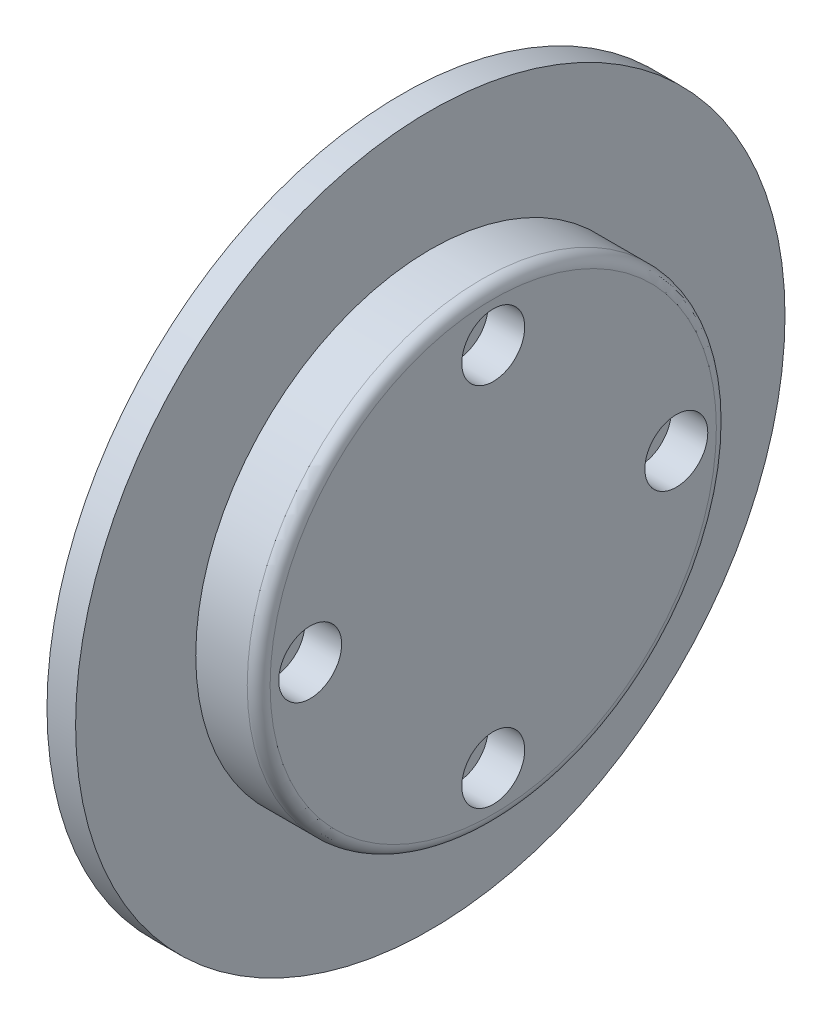
ISO-10303-21;
HEADER;
FILE_DESCRIPTION(('STEP AP214'),'2;1');
FILE_NAME('part.step','',(''),(''),'','','');
FILE_SCHEMA(('AUTOMOTIVE_DESIGN { 1 0 10303 214 1 1 1 1 }'));
ENDSEC;
DATA;
#1=APPLICATION_CONTEXT('core data for automotive mechanical design processes');
#2=APPLICATION_PROTOCOL_DEFINITION('international standard','automotive_design',2000,#1);
#3=PRODUCT_CONTEXT('',#1,'mechanical');
#4=PRODUCT('Part','Part','',(#3));
#5=PRODUCT_RELATED_PRODUCT_CATEGORY('part','',(#4));
#6=PRODUCT_DEFINITION_FORMATION('','',#4);
#7=PRODUCT_DEFINITION_CONTEXT('part definition',#1,'design');
#8=PRODUCT_DEFINITION('design','',#6,#7);
#9=PRODUCT_DEFINITION_SHAPE('','',#8);
#10=(LENGTH_UNIT() NAMED_UNIT(*) SI_UNIT(.MILLI.,.METRE.));
#11=(NAMED_UNIT(*) PLANE_ANGLE_UNIT() SI_UNIT($,.RADIAN.));
#12=(NAMED_UNIT(*) SI_UNIT($,.STERADIAN.) SOLID_ANGLE_UNIT());
#13=UNCERTAINTY_MEASURE_WITH_UNIT(LENGTH_MEASURE(1.E-05),#10,'distance_accuracy_value','');
#14=(GEOMETRIC_REPRESENTATION_CONTEXT(3) GLOBAL_UNCERTAINTY_ASSIGNED_CONTEXT((#13)) GLOBAL_UNIT_ASSIGNED_CONTEXT((#10,
#11,#12)) REPRESENTATION_CONTEXT('',''));
#15=CARTESIAN_POINT('',(0.,0.,0.));
#16=DIRECTION('',(0.,0.,1.));
#17=DIRECTION('',(1.,0.,0.));
#18=AXIS2_PLACEMENT_3D('',#15,#16,#17);
#19=CARTESIAN_POINT('',(0.,0.,0.));
#20=DIRECTION('',(-1.,0.,0.));
#21=DIRECTION('',(0.,0.,1.));
#22=AXIS2_PLACEMENT_3D('',#19,#20,#21);
#23=PLANE('',#22);
#24=CARTESIAN_POINT('',(0.,-32.,0.));
#25=DIRECTION('',(1.,0.,0.));
#26=DIRECTION('',(0.,0.,-1.));
#27=AXIS2_PLACEMENT_3D('',#24,#25,#26);
#28=CIRCLE('',#27,3.3);
#29=CARTESIAN_POINT('',(0.,-32.,-3.3));
#30=VERTEX_POINT('',#29);
#31=EDGE_CURVE('E100',#30,#30,#28,.T.);
#32=ORIENTED_EDGE('',*,*,#31,.T.);
#33=EDGE_LOOP('',(#32));
#34=FACE_BOUND('',#33,.T.);
#35=CARTESIAN_POINT('',(0.,0.,-32.));
#36=DIRECTION('',(1.,0.,0.));
#37=DIRECTION('',(0.,0.,-1.));
#38=AXIS2_PLACEMENT_3D('',#35,#36,#37);
#39=CIRCLE('',#38,3.3);
#40=CARTESIAN_POINT('',(0.,0.,-35.3));
#41=VERTEX_POINT('',#40);
#42=EDGE_CURVE('E88',#41,#41,#39,.T.);
#43=ORIENTED_EDGE('',*,*,#42,.T.);
#44=EDGE_LOOP('',(#43));
#45=FACE_BOUND('',#44,.T.);
#46=CARTESIAN_POINT('',(0.,32.,0.));
#47=DIRECTION('',(1.,0.,0.));
#48=DIRECTION('',(0.,0.,-1.));
#49=AXIS2_PLACEMENT_3D('',#46,#47,#48);
#50=CIRCLE('',#49,3.3);
#51=CARTESIAN_POINT('',(0.,32.,-3.3));
#52=VERTEX_POINT('',#51);
#53=EDGE_CURVE('E76',#52,#52,#50,.T.);
#54=ORIENTED_EDGE('',*,*,#53,.T.);
#55=EDGE_LOOP('',(#54));
#56=FACE_BOUND('',#55,.T.);
#57=CARTESIAN_POINT('',(0.,0.,32.));
#58=DIRECTION('',(1.,0.,0.));
#59=DIRECTION('',(0.,0.,-1.));
#60=AXIS2_PLACEMENT_3D('',#57,#58,#59);
#61=CIRCLE('',#60,3.3);
#62=CARTESIAN_POINT('',(0.,0.,28.7));
#63=VERTEX_POINT('',#62);
#64=EDGE_CURVE('E64',#63,#63,#61,.T.);
#65=ORIENTED_EDGE('',*,*,#64,.T.);
#66=EDGE_LOOP('',(#65));
#67=FACE_BOUND('',#66,.T.);
#68=CARTESIAN_POINT('',(0.,0.,0.));
#69=DIRECTION('',(-1.,0.,0.));
#70=DIRECTION('',(0.,0.,1.));
#71=AXIS2_PLACEMENT_3D('',#68,#69,#70);
#72=CIRCLE('',#71,21.);
#73=CARTESIAN_POINT('',(0.,0.,21.));
#74=VERTEX_POINT('',#73);
#75=EDGE_CURVE('E61',#74,#74,#72,.T.);
#76=ORIENTED_EDGE('',*,*,#75,.F.);
#77=EDGE_LOOP('',(#76));
#78=FACE_BOUND('',#77,.T.);
#79=CARTESIAN_POINT('',(0.,0.,0.));
#80=DIRECTION('',(1.,0.,0.));
#81=DIRECTION('',(0.,0.,-1.));
#82=AXIS2_PLACEMENT_3D('',#79,#80,#81);
#83=CIRCLE('',#82,62.);
#84=CARTESIAN_POINT('',(0.,0.,-62.));
#85=VERTEX_POINT('',#84);
#86=EDGE_CURVE('E52',#85,#85,#83,.T.);
#87=ORIENTED_EDGE('',*,*,#86,.F.);
#88=EDGE_LOOP('',(#87));
#89=FACE_BOUND('',#88,.T.);
#90=ADVANCED_FACE('F32',(#34,#45,#56,#67,#78,#89),#23,.T.);
#91=CARTESIAN_POINT('',(16.,0.,0.));
#92=DIRECTION('',(1.,0.,0.));
#93=DIRECTION('',(0.,0.,-1.));
#94=AXIS2_PLACEMENT_3D('',#91,#92,#93);
#95=CYLINDRICAL_SURFACE('',#94,62.);
#96=ORIENTED_EDGE('',*,*,#86,.T.);
#97=EDGE_LOOP('',(#96));
#98=FACE_BOUND('',#97,.T.);
#99=CARTESIAN_POINT('',(5.,0.,0.));
#100=DIRECTION('',(1.,0.,0.));
#101=DIRECTION('',(0.,0.,-1.));
#102=AXIS2_PLACEMENT_3D('',#99,#100,#101);
#103=CIRCLE('',#102,62.);
#104=CARTESIAN_POINT('',(5.,0.,-62.));
#105=VERTEX_POINT('',#104);
#106=EDGE_CURVE('E55',#105,#105,#103,.T.);
#107=ORIENTED_EDGE('',*,*,#106,.F.);
#108=EDGE_LOOP('',(#107));
#109=FACE_BOUND('',#108,.T.);
#110=ADVANCED_FACE('F145',(#98,#109),#95,.T.);
#111=CARTESIAN_POINT('',(5.,62.,0.));
#112=DIRECTION('',(1.,0.,0.));
#113=DIRECTION('',(0.,0.,-1.));
#114=AXIS2_PLACEMENT_3D('',#111,#112,#113);
#115=PLANE('',#114);
#116=ORIENTED_EDGE('',*,*,#106,.T.);
#117=EDGE_LOOP('',(#116));
#118=FACE_BOUND('',#117,.T.);
#119=CARTESIAN_POINT('',(5.,0.,0.));
#120=DIRECTION('',(1.,0.,0.));
#121=DIRECTION('',(0.,0.,-1.));
#122=AXIS2_PLACEMENT_3D('',#119,#120,#121);
#123=CIRCLE('',#122,41.);
#124=CARTESIAN_POINT('',(5.,0.,-41.));
#125=VERTEX_POINT('',#124);
#126=EDGE_CURVE('E58',#125,#125,#123,.T.);
#127=ORIENTED_EDGE('',*,*,#126,.F.);
#128=EDGE_LOOP('',(#127));
#129=FACE_BOUND('',#128,.T.);
#130=ADVANCED_FACE('F151',(#118,#129),#115,.T.);
#131=CARTESIAN_POINT('',(16.,0.,0.));
#132=DIRECTION('',(1.,0.,0.));
#133=DIRECTION('',(0.,0.,-1.));
#134=AXIS2_PLACEMENT_3D('',#131,#132,#133);
#135=CYLINDRICAL_SURFACE('',#134,41.);
#136=CARTESIAN_POINT('',(14.,0.,0.));
#137=DIRECTION('',(1.,0.,0.));
#138=DIRECTION('',(0.,0.,-1.));
#139=AXIS2_PLACEMENT_3D('',#136,#137,#138);
#140=CIRCLE('',#139,41.);
#141=CARTESIAN_POINT('',(14.,0.,-41.));
#142=VERTEX_POINT('',#141);
#143=EDGE_CURVE('E10',#142,#142,#140,.F.);
#144=ORIENTED_EDGE('',*,*,#143,.T.);
#145=EDGE_LOOP('',(#144));
#146=FACE_BOUND('',#145,.T.);
#147=ORIENTED_EDGE('',*,*,#126,.T.);
#148=EDGE_LOOP('',(#147));
#149=FACE_BOUND('',#148,.T.);
#150=ADVANCED_FACE('F119',(#146,#149),#135,.T.);
#151=CARTESIAN_POINT('',(16.,41.,0.));
#152=DIRECTION('',(1.,0.,0.));
#153=DIRECTION('',(0.,0.,-1.));
#154=AXIS2_PLACEMENT_3D('',#151,#152,#153);
#155=PLANE('',#154);
#156=CARTESIAN_POINT('',(16.,-32.,0.));
#157=DIRECTION('',(1.,0.,0.));
#158=DIRECTION('',(0.,0.,-1.));
#159=AXIS2_PLACEMENT_3D('',#156,#157,#158);
#160=CIRCLE('',#159,5.5);
#161=CARTESIAN_POINT('',(16.,-32.,-5.5));
#162=VERTEX_POINT('',#161);
#163=EDGE_CURVE('E109',#162,#162,#160,.T.);
#164=ORIENTED_EDGE('',*,*,#163,.F.);
#165=EDGE_LOOP('',(#164));
#166=FACE_BOUND('',#165,.T.);
#167=CARTESIAN_POINT('',(16.,0.,-32.));
#168=DIRECTION('',(1.,0.,0.));
#169=DIRECTION('',(0.,0.,-1.));
#170=AXIS2_PLACEMENT_3D('',#167,#168,#169);
#171=CIRCLE('',#170,5.5);
#172=CARTESIAN_POINT('',(16.,0.,-37.5));
#173=VERTEX_POINT('',#172);
#174=EDGE_CURVE('E97',#173,#173,#171,.T.);
#175=ORIENTED_EDGE('',*,*,#174,.F.);
#176=EDGE_LOOP('',(#175));
#177=FACE_BOUND('',#176,.T.);
#178=CARTESIAN_POINT('',(16.,32.,0.));
#179=DIRECTION('',(1.,0.,0.));
#180=DIRECTION('',(0.,0.,-1.));
#181=AXIS2_PLACEMENT_3D('',#178,#179,#180);
#182=CIRCLE('',#181,5.5);
#183=CARTESIAN_POINT('',(16.,32.,-5.5));
#184=VERTEX_POINT('',#183);
#185=EDGE_CURVE('E85',#184,#184,#182,.T.);
#186=ORIENTED_EDGE('',*,*,#185,.F.);
#187=EDGE_LOOP('',(#186));
#188=FACE_BOUND('',#187,.T.);
#189=CARTESIAN_POINT('',(16.,0.,32.));
#190=DIRECTION('',(1.,0.,0.));
#191=DIRECTION('',(0.,0.,-1.));
#192=AXIS2_PLACEMENT_3D('',#189,#190,#191);
#193=CIRCLE('',#192,5.5);
#194=CARTESIAN_POINT('',(16.,0.,26.5));
#195=VERTEX_POINT('',#194);
#196=EDGE_CURVE('E73',#195,#195,#193,.T.);
#197=ORIENTED_EDGE('',*,*,#196,.F.);
#198=EDGE_LOOP('',(#197));
#199=FACE_BOUND('',#198,.T.);
#200=CARTESIAN_POINT('',(16.,0.,0.));
#201=DIRECTION('',(1.,0.,0.));
#202=DIRECTION('',(0.,0.,-1.));
#203=AXIS2_PLACEMENT_3D('',#200,#201,#202);
#204=CIRCLE('',#203,39.);
#205=CARTESIAN_POINT('',(16.,0.,-39.));
#206=VERTEX_POINT('',#205);
#207=EDGE_CURVE('E39',#206,#206,#204,.T.);
#208=ORIENTED_EDGE('',*,*,#207,.T.);
#209=EDGE_LOOP('',(#208));
#210=FACE_BOUND('',#209,.T.);
#211=ADVANCED_FACE('F115',(#166,#177,#188,#199,#210),#155,.T.);
#212=CARTESIAN_POINT('',(12.,0.,0.));
#213=DIRECTION('',(-1.,0.,0.));
#214=DIRECTION('',(0.,0.,1.));
#215=AXIS2_PLACEMENT_3D('',#212,#213,#214);
#216=CYLINDRICAL_SURFACE('',#215,21.);
#217=CARTESIAN_POINT('',(11.,0.,0.));
#218=DIRECTION('',(-1.,0.,0.));
#219=DIRECTION('',(0.,0.,1.));
#220=AXIS2_PLACEMENT_3D('',#217,#218,#219);
#221=CIRCLE('',#220,21.);
#222=CARTESIAN_POINT('',(11.,0.,21.));
#223=VERTEX_POINT('',#222);
#224=EDGE_CURVE('E43',#223,#223,#221,.F.);
#225=ORIENTED_EDGE('',*,*,#224,.T.);
#226=EDGE_LOOP('',(#225));
#227=FACE_BOUND('',#226,.T.);
#228=ORIENTED_EDGE('',*,*,#75,.T.);
#229=EDGE_LOOP('',(#228));
#230=FACE_BOUND('',#229,.T.);
#231=ADVANCED_FACE('F118',(#227,#230),#216,.F.);
#232=CARTESIAN_POINT('',(12.,0.,0.));
#233=DIRECTION('',(-1.,0.,0.));
#234=DIRECTION('',(0.,0.,1.));
#235=AXIS2_PLACEMENT_3D('',#232,#233,#234);
#236=PLANE('',#235);
#237=CARTESIAN_POINT('',(12.,0.,0.));
#238=DIRECTION('',(-1.,0.,0.));
#239=DIRECTION('',(0.,0.,1.));
#240=AXIS2_PLACEMENT_3D('',#237,#238,#239);
#241=CIRCLE('',#240,20.);
#242=CARTESIAN_POINT('',(12.,0.,20.));
#243=VERTEX_POINT('',#242);
#244=EDGE_CURVE('E47',#243,#243,#241,.T.);
#245=ORIENTED_EDGE('',*,*,#244,.T.);
#246=EDGE_LOOP('',(#245));
#247=FACE_BOUND('',#246,.T.);
#248=ADVANCED_FACE('F158',(#247),#236,.T.);
#249=CARTESIAN_POINT('',(11.,0.,0.));
#250=DIRECTION('',(-1.,0.,0.));
#251=DIRECTION('',(0.,0.,1.));
#252=AXIS2_PLACEMENT_3D('',#249,#250,#251);
#253=TOROIDAL_SURFACE('',#252,20.,1.);
#254=ORIENTED_EDGE('',*,*,#224,.F.);
#255=EDGE_LOOP('',(#254));
#256=FACE_BOUND('',#255,.T.);
#257=ORIENTED_EDGE('',*,*,#244,.F.);
#258=EDGE_LOOP('',(#257));
#259=FACE_BOUND('',#258,.T.);
#260=ADVANCED_FACE('F156',(#256,#259),#253,.F.);
#261=CARTESIAN_POINT('',(14.,0.,0.));
#262=DIRECTION('',(1.,0.,0.));
#263=DIRECTION('',(0.,0.,-1.));
#264=AXIS2_PLACEMENT_3D('',#261,#262,#263);
#265=TOROIDAL_SURFACE('',#264,39.,2.);
#266=ORIENTED_EDGE('',*,*,#143,.F.);
#267=EDGE_LOOP('',(#266));
#268=FACE_BOUND('',#267,.T.);
#269=ORIENTED_EDGE('',*,*,#207,.F.);
#270=EDGE_LOOP('',(#269));
#271=FACE_BOUND('',#270,.T.);
#272=ADVANCED_FACE('F34',(#268,#271),#265,.T.);
#273=CARTESIAN_POINT('',(16.,0.,32.));
#274=DIRECTION('',(1.,0.,0.));
#275=DIRECTION('',(0.,0.,-1.));
#276=AXIS2_PLACEMENT_3D('',#273,#274,#275);
#277=CYLINDRICAL_SURFACE('',#276,3.3);
#278=ORIENTED_EDGE('',*,*,#64,.F.);
#279=EDGE_LOOP('',(#278));
#280=FACE_BOUND('',#279,.T.);
#281=CARTESIAN_POINT('',(9.6,0.,32.));
#282=DIRECTION('',(1.,0.,0.));
#283=DIRECTION('',(0.,0.,-1.));
#284=AXIS2_PLACEMENT_3D('',#281,#282,#283);
#285=CIRCLE('',#284,3.3);
#286=CARTESIAN_POINT('',(9.6,0.,28.7));
#287=VERTEX_POINT('',#286);
#288=EDGE_CURVE('E67',#287,#287,#285,.T.);
#289=ORIENTED_EDGE('',*,*,#288,.T.);
#290=EDGE_LOOP('',(#289));
#291=FACE_BOUND('',#290,.T.);
#292=ADVANCED_FACE('F140',(#280,#291),#277,.F.);
#293=CARTESIAN_POINT('',(9.6,3.3,32.));
#294=DIRECTION('',(-1.,0.,0.));
#295=DIRECTION('',(0.,0.,1.));
#296=AXIS2_PLACEMENT_3D('',#293,#294,#295);
#297=PLANE('',#296);
#298=ORIENTED_EDGE('',*,*,#288,.F.);
#299=EDGE_LOOP('',(#298));
#300=FACE_BOUND('',#299,.T.);
#301=CARTESIAN_POINT('',(9.6,0.,32.));
#302=DIRECTION('',(1.,0.,0.));
#303=DIRECTION('',(0.,0.,-1.));
#304=AXIS2_PLACEMENT_3D('',#301,#302,#303);
#305=CIRCLE('',#304,5.5);
#306=CARTESIAN_POINT('',(9.6,0.,26.5));
#307=VERTEX_POINT('',#306);
#308=EDGE_CURVE('E70',#307,#307,#305,.T.);
#309=ORIENTED_EDGE('',*,*,#308,.T.);
#310=EDGE_LOOP('',(#309));
#311=FACE_BOUND('',#310,.T.);
#312=ADVANCED_FACE('F130',(#300,#311),#297,.F.);
#313=CARTESIAN_POINT('',(16.,0.,32.));
#314=DIRECTION('',(1.,0.,0.));
#315=DIRECTION('',(0.,0.,-1.));
#316=AXIS2_PLACEMENT_3D('',#313,#314,#315);
#317=CYLINDRICAL_SURFACE('',#316,5.5);
#318=ORIENTED_EDGE('',*,*,#308,.F.);
#319=EDGE_LOOP('',(#318));
#320=FACE_BOUND('',#319,.T.);
#321=ORIENTED_EDGE('',*,*,#196,.T.);
#322=EDGE_LOOP('',(#321));
#323=FACE_BOUND('',#322,.T.);
#324=ADVANCED_FACE('F127',(#320,#323),#317,.F.);
#325=CARTESIAN_POINT('',(16.,32.,0.));
#326=DIRECTION('',(1.,0.,0.));
#327=DIRECTION('',(0.,0.,-1.));
#328=AXIS2_PLACEMENT_3D('',#325,#326,#327);
#329=CYLINDRICAL_SURFACE('',#328,3.3);
#330=ORIENTED_EDGE('',*,*,#53,.F.);
#331=EDGE_LOOP('',(#330));
#332=FACE_BOUND('',#331,.T.);
#333=CARTESIAN_POINT('',(9.6,32.,0.));
#334=DIRECTION('',(1.,0.,0.));
#335=DIRECTION('',(0.,0.,-1.));
#336=AXIS2_PLACEMENT_3D('',#333,#334,#335);
#337=CIRCLE('',#336,3.3);
#338=CARTESIAN_POINT('',(9.6,32.,-3.3));
#339=VERTEX_POINT('',#338);
#340=EDGE_CURVE('E79',#339,#339,#337,.T.);
#341=ORIENTED_EDGE('',*,*,#340,.T.);
#342=EDGE_LOOP('',(#341));
#343=FACE_BOUND('',#342,.T.);
#344=ADVANCED_FACE('F129',(#332,#343),#329,.F.);
#345=CARTESIAN_POINT('',(9.6,35.3,0.));
#346=DIRECTION('',(-1.,0.,0.));
#347=DIRECTION('',(0.,0.,1.));
#348=AXIS2_PLACEMENT_3D('',#345,#346,#347);
#349=PLANE('',#348);
#350=ORIENTED_EDGE('',*,*,#340,.F.);
#351=EDGE_LOOP('',(#350));
#352=FACE_BOUND('',#351,.T.);
#353=CARTESIAN_POINT('',(9.6,32.,0.));
#354=DIRECTION('',(1.,0.,0.));
#355=DIRECTION('',(0.,0.,-1.));
#356=AXIS2_PLACEMENT_3D('',#353,#354,#355);
#357=CIRCLE('',#356,5.5);
#358=CARTESIAN_POINT('',(9.6,32.,-5.5));
#359=VERTEX_POINT('',#358);
#360=EDGE_CURVE('E82',#359,#359,#357,.T.);
#361=ORIENTED_EDGE('',*,*,#360,.T.);
#362=EDGE_LOOP('',(#361));
#363=FACE_BOUND('',#362,.T.);
#364=ADVANCED_FACE('F137',(#352,#363),#349,.F.);
#365=CARTESIAN_POINT('',(16.,32.,0.));
#366=DIRECTION('',(1.,0.,0.));
#367=DIRECTION('',(0.,0.,-1.));
#368=AXIS2_PLACEMENT_3D('',#365,#366,#367);
#369=CYLINDRICAL_SURFACE('',#368,5.5);
#370=ORIENTED_EDGE('',*,*,#360,.F.);
#371=EDGE_LOOP('',(#370));
#372=FACE_BOUND('',#371,.T.);
#373=ORIENTED_EDGE('',*,*,#185,.T.);
#374=EDGE_LOOP('',(#373));
#375=FACE_BOUND('',#374,.T.);
#376=ADVANCED_FACE('F225',(#372,#375),#369,.F.);
#377=CARTESIAN_POINT('',(16.,0.,-32.));
#378=DIRECTION('',(1.,0.,0.));
#379=DIRECTION('',(0.,0.,-1.));
#380=AXIS2_PLACEMENT_3D('',#377,#378,#379);
#381=CYLINDRICAL_SURFACE('',#380,3.3);
#382=ORIENTED_EDGE('',*,*,#42,.F.);
#383=EDGE_LOOP('',(#382));
#384=FACE_BOUND('',#383,.T.);
#385=CARTESIAN_POINT('',(9.6,0.,-32.));
#386=DIRECTION('',(1.,0.,0.));
#387=DIRECTION('',(0.,0.,-1.));
#388=AXIS2_PLACEMENT_3D('',#385,#386,#387);
#389=CIRCLE('',#388,3.3);
#390=CARTESIAN_POINT('',(9.6,0.,-35.3));
#391=VERTEX_POINT('',#390);
#392=EDGE_CURVE('E91',#391,#391,#389,.T.);
#393=ORIENTED_EDGE('',*,*,#392,.T.);
#394=EDGE_LOOP('',(#393));
#395=FACE_BOUND('',#394,.T.);
#396=ADVANCED_FACE('F235',(#384,#395),#381,.F.);
#397=CARTESIAN_POINT('',(9.6,3.3,-32.));
#398=DIRECTION('',(-1.,0.,0.));
#399=DIRECTION('',(0.,0.,1.));
#400=AXIS2_PLACEMENT_3D('',#397,#398,#399);
#401=PLANE('',#400);
#402=ORIENTED_EDGE('',*,*,#392,.F.);
#403=EDGE_LOOP('',(#402));
#404=FACE_BOUND('',#403,.T.);
#405=CARTESIAN_POINT('',(9.6,0.,-32.));
#406=DIRECTION('',(1.,0.,0.));
#407=DIRECTION('',(0.,0.,-1.));
#408=AXIS2_PLACEMENT_3D('',#405,#406,#407);
#409=CIRCLE('',#408,5.5);
#410=CARTESIAN_POINT('',(9.6,0.,-37.5));
#411=VERTEX_POINT('',#410);
#412=EDGE_CURVE('E94',#411,#411,#409,.T.);
#413=ORIENTED_EDGE('',*,*,#412,.T.);
#414=EDGE_LOOP('',(#413));
#415=FACE_BOUND('',#414,.T.);
#416=ADVANCED_FACE('F245',(#404,#415),#401,.F.);
#417=CARTESIAN_POINT('',(16.,0.,-32.));
#418=DIRECTION('',(1.,0.,0.));
#419=DIRECTION('',(0.,0.,-1.));
#420=AXIS2_PLACEMENT_3D('',#417,#418,#419);
#421=CYLINDRICAL_SURFACE('',#420,5.5);
#422=ORIENTED_EDGE('',*,*,#412,.F.);
#423=EDGE_LOOP('',(#422));
#424=FACE_BOUND('',#423,.T.);
#425=ORIENTED_EDGE('',*,*,#174,.T.);
#426=EDGE_LOOP('',(#425));
#427=FACE_BOUND('',#426,.T.);
#428=ADVANCED_FACE('F255',(#424,#427),#421,.F.);
#429=CARTESIAN_POINT('',(16.,-32.,0.));
#430=DIRECTION('',(1.,0.,0.));
#431=DIRECTION('',(0.,0.,-1.));
#432=AXIS2_PLACEMENT_3D('',#429,#430,#431);
#433=CYLINDRICAL_SURFACE('',#432,3.3);
#434=ORIENTED_EDGE('',*,*,#31,.F.);
#435=EDGE_LOOP('',(#434));
#436=FACE_BOUND('',#435,.T.);
#437=CARTESIAN_POINT('',(9.6,-32.,0.));
#438=DIRECTION('',(1.,0.,0.));
#439=DIRECTION('',(0.,0.,-1.));
#440=AXIS2_PLACEMENT_3D('',#437,#438,#439);
#441=CIRCLE('',#440,3.3);
#442=CARTESIAN_POINT('',(9.6,-32.,-3.3));
#443=VERTEX_POINT('',#442);
#444=EDGE_CURVE('E103',#443,#443,#441,.T.);
#445=ORIENTED_EDGE('',*,*,#444,.T.);
#446=EDGE_LOOP('',(#445));
#447=FACE_BOUND('',#446,.T.);
#448=ADVANCED_FACE('F265',(#436,#447),#433,.F.);
#449=CARTESIAN_POINT('',(9.6,-28.7,0.));
#450=DIRECTION('',(-1.,0.,0.));
#451=DIRECTION('',(0.,0.,1.));
#452=AXIS2_PLACEMENT_3D('',#449,#450,#451);
#453=PLANE('',#452);
#454=ORIENTED_EDGE('',*,*,#444,.F.);
#455=EDGE_LOOP('',(#454));
#456=FACE_BOUND('',#455,.T.);
#457=CARTESIAN_POINT('',(9.6,-32.,0.));
#458=DIRECTION('',(1.,0.,0.));
#459=DIRECTION('',(0.,0.,-1.));
#460=AXIS2_PLACEMENT_3D('',#457,#458,#459);
#461=CIRCLE('',#460,5.5);
#462=CARTESIAN_POINT('',(9.6,-32.,-5.5));
#463=VERTEX_POINT('',#462);
#464=EDGE_CURVE('E106',#463,#463,#461,.T.);
#465=ORIENTED_EDGE('',*,*,#464,.T.);
#466=EDGE_LOOP('',(#465));
#467=FACE_BOUND('',#466,.T.);
#468=ADVANCED_FACE('F275',(#456,#467),#453,.F.);
#469=CARTESIAN_POINT('',(16.,-32.,0.));
#470=DIRECTION('',(1.,0.,0.));
#471=DIRECTION('',(0.,0.,-1.));
#472=AXIS2_PLACEMENT_3D('',#469,#470,#471);
#473=CYLINDRICAL_SURFACE('',#472,5.5);
#474=ORIENTED_EDGE('',*,*,#464,.F.);
#475=EDGE_LOOP('',(#474));
#476=FACE_BOUND('',#475,.T.);
#477=ORIENTED_EDGE('',*,*,#163,.T.);
#478=EDGE_LOOP('',(#477));
#479=FACE_BOUND('',#478,.T.);
#480=ADVANCED_FACE('F113',(#476,#479),#473,.F.);
#481=CLOSED_SHELL('',(#90,#110,#130,#150,#211,#231,#248,#260,#272,#292,#312,#324,#344,#364,#376,
#396,#416,#428,#448,#468,#480));
#482=MANIFOLD_SOLID_BREP('B2',#481);
#483=ADVANCED_BREP_SHAPE_REPRESENTATION('',(#18,#482),#14);
#484=SHAPE_DEFINITION_REPRESENTATION(#9,#483);
ENDSEC;
END-ISO-10303-21;
